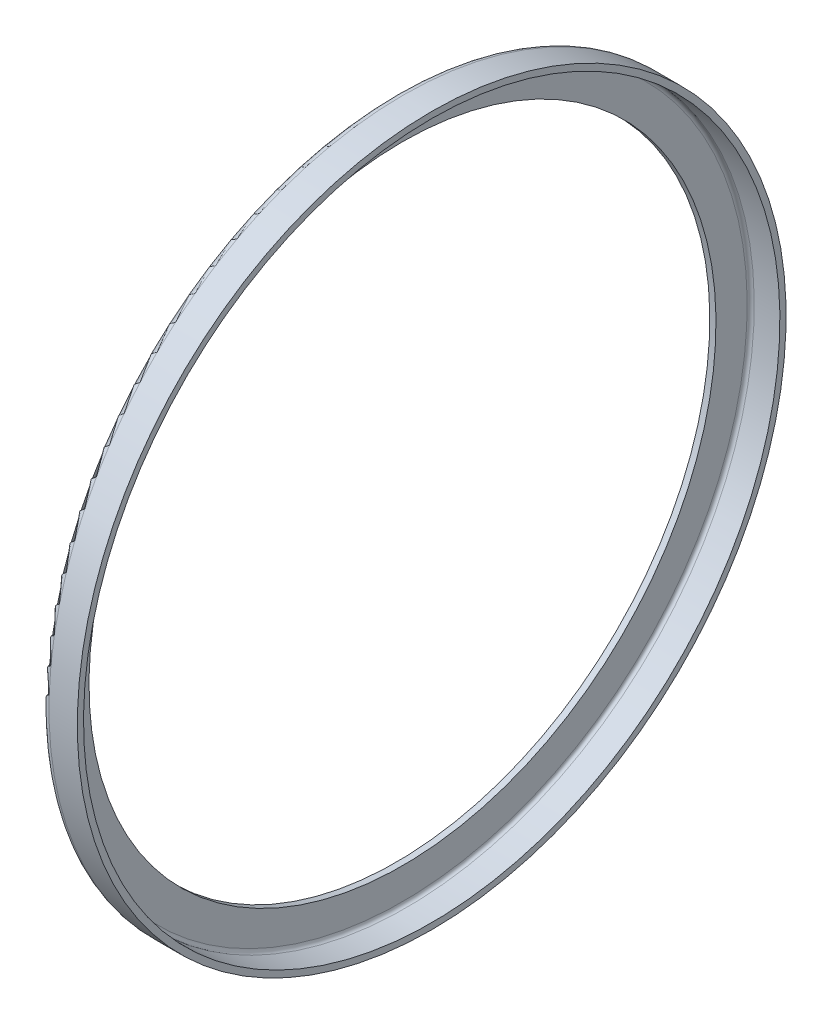
ISO-10303-21;
HEADER;
FILE_DESCRIPTION(('STEP AP214'),'2;1');
FILE_NAME('part.step','',(''),(''),'','','');
FILE_SCHEMA(('AUTOMOTIVE_DESIGN { 1 0 10303 214 1 1 1 1 }'));
ENDSEC;
DATA;
#1=APPLICATION_CONTEXT('core data for automotive mechanical design processes');
#2=APPLICATION_PROTOCOL_DEFINITION('international standard','automotive_design',2000,#1);
#3=PRODUCT_CONTEXT('',#1,'mechanical');
#4=PRODUCT('Part','Part','',(#3));
#5=PRODUCT_RELATED_PRODUCT_CATEGORY('part','',(#4));
#6=PRODUCT_DEFINITION_FORMATION('','',#4);
#7=PRODUCT_DEFINITION_CONTEXT('part definition',#1,'design');
#8=PRODUCT_DEFINITION('design','',#6,#7);
#9=PRODUCT_DEFINITION_SHAPE('','',#8);
#10=(LENGTH_UNIT() NAMED_UNIT(*) SI_UNIT(.MILLI.,.METRE.));
#11=(NAMED_UNIT(*) PLANE_ANGLE_UNIT() SI_UNIT($,.RADIAN.));
#12=(NAMED_UNIT(*) SI_UNIT($,.STERADIAN.) SOLID_ANGLE_UNIT());
#13=UNCERTAINTY_MEASURE_WITH_UNIT(LENGTH_MEASURE(1.E-05),#10,'distance_accuracy_value','');
#14=(GEOMETRIC_REPRESENTATION_CONTEXT(3) GLOBAL_UNCERTAINTY_ASSIGNED_CONTEXT((#13)) GLOBAL_UNIT_ASSIGNED_CONTEXT((#10,
#11,#12)) REPRESENTATION_CONTEXT('',''));
#15=CARTESIAN_POINT('',(0.,0.,0.));
#16=DIRECTION('',(0.,0.,1.));
#17=DIRECTION('',(1.,0.,0.));
#18=AXIS2_PLACEMENT_3D('',#15,#16,#17);
#19=CARTESIAN_POINT('',(0.2625,0.,0.));
#20=DIRECTION('',(1.,0.,0.));
#21=DIRECTION('',(0.,1.,0.));
#22=AXIS2_PLACEMENT_3D('',#19,#20,#21);
#23=CYLINDRICAL_SURFACE('',#22,26.5625);
#24=CARTESIAN_POINT('',(0.,0.,0.));
#25=DIRECTION('',(-1.,0.,0.));
#26=DIRECTION('',(0.,1.,0.));
#27=AXIS2_PLACEMENT_3D('',#24,#25,#26);
#28=CIRCLE('',#27,26.5625);
#29=CARTESIAN_POINT('',(0.,26.5625,0.));
#30=VERTEX_POINT('',#29);
#31=EDGE_CURVE('E11',#30,#30,#28,.T.);
#32=ORIENTED_EDGE('',*,*,#31,.T.);
#33=EDGE_LOOP('',(#32));
#34=FACE_BOUND('',#33,.T.);
#35=CARTESIAN_POINT('',(0.525,0.,0.));
#36=DIRECTION('',(-1.,0.,0.));
#37=DIRECTION('',(0.,1.,0.));
#38=AXIS2_PLACEMENT_3D('',#35,#36,#37);
#39=CIRCLE('',#38,26.5625);
#40=CARTESIAN_POINT('',(0.525,26.5625,0.));
#41=VERTEX_POINT('',#40);
#42=EDGE_CURVE('E62',#41,#41,#39,.T.);
#43=ORIENTED_EDGE('',*,*,#42,.F.);
#44=EDGE_LOOP('',(#43));
#45=FACE_BOUND('',#44,.T.);
#46=ADVANCED_FACE('F17',(#34,#45),#23,.F.);
#47=CARTESIAN_POINT('',(0.,27.995,0.));
#48=DIRECTION('',(-1.,0.,0.));
#49=DIRECTION('',(0.,1.,0.));
#50=AXIS2_PLACEMENT_3D('',#47,#48,#49);
#51=PLANE('',#50);
#52=CARTESIAN_POINT('',(0.,0.,0.));
#53=DIRECTION('',(-1.,0.,0.));
#54=DIRECTION('',(0.,1.,0.));
#55=AXIS2_PLACEMENT_3D('',#52,#53,#54);
#56=CIRCLE('',#55,29.4275);
#57=CARTESIAN_POINT('',(0.,29.4275,0.));
#58=VERTEX_POINT('',#57);
#59=EDGE_CURVE('E26',#58,#58,#56,.T.);
#60=ORIENTED_EDGE('',*,*,#59,.T.);
#61=EDGE_LOOP('',(#60));
#62=FACE_BOUND('',#61,.T.);
#63=ORIENTED_EDGE('',*,*,#31,.F.);
#64=EDGE_LOOP('',(#63));
#65=FACE_BOUND('',#64,.T.);
#66=ADVANCED_FACE('F71',(#62,#65),#51,.T.);
#67=CARTESIAN_POINT('',(0.6,0.,0.));
#68=DIRECTION('',(-1.,0.,0.));
#69=DIRECTION('',(0.,0.,1.));
#70=AXIS2_PLACEMENT_3D('',#67,#68,#69);
#71=TOROIDAL_SURFACE('',#70,29.4275,0.6);
#72=CARTESIAN_POINT('',(0.6,0.,0.));
#73=DIRECTION('',(-1.,0.,0.));
#74=DIRECTION('',(0.,1.,0.));
#75=AXIS2_PLACEMENT_3D('',#72,#73,#74);
#76=CIRCLE('',#75,30.0275);
#77=CARTESIAN_POINT('',(0.6,30.0275,0.));
#78=VERTEX_POINT('',#77);
#79=EDGE_CURVE('E52',#78,#78,#76,.T.);
#80=ORIENTED_EDGE('',*,*,#79,.T.);
#81=EDGE_LOOP('',(#80));
#82=FACE_BOUND('',#81,.T.);
#83=ORIENTED_EDGE('',*,*,#59,.F.);
#84=EDGE_LOOP('',(#83));
#85=FACE_BOUND('',#84,.T.);
#86=ADVANCED_FACE('F19',(#82,#85),#71,.T.);
#87=CARTESIAN_POINT('',(1.8,0.,0.));
#88=DIRECTION('',(1.,0.,0.));
#89=DIRECTION('',(0.,1.,0.));
#90=AXIS2_PLACEMENT_3D('',#87,#88,#89);
#91=CYLINDRICAL_SURFACE('',#90,30.0275);
#92=CARTESIAN_POINT('',(3.,0.,0.));
#93=DIRECTION('',(-1.,0.,0.));
#94=DIRECTION('',(0.,1.,0.));
#95=AXIS2_PLACEMENT_3D('',#92,#93,#94);
#96=CIRCLE('',#95,30.0275);
#97=CARTESIAN_POINT('',(3.,30.0275,0.));
#98=VERTEX_POINT('',#97);
#99=EDGE_CURVE('E48',#98,#98,#96,.T.);
#100=ORIENTED_EDGE('',*,*,#99,.T.);
#101=EDGE_LOOP('',(#100));
#102=FACE_BOUND('',#101,.T.);
#103=ORIENTED_EDGE('',*,*,#79,.F.);
#104=EDGE_LOOP('',(#103));
#105=FACE_BOUND('',#104,.T.);
#106=ADVANCED_FACE('F49',(#102,#105),#91,.T.);
#107=CARTESIAN_POINT('',(3.,29.765,0.));
#108=DIRECTION('',(1.,0.,0.));
#109=DIRECTION('',(0.,-1.,0.));
#110=AXIS2_PLACEMENT_3D('',#107,#108,#109);
#111=PLANE('',#110);
#112=CARTESIAN_POINT('',(3.,0.,0.));
#113=DIRECTION('',(-1.,0.,0.));
#114=DIRECTION('',(0.,1.,0.));
#115=AXIS2_PLACEMENT_3D('',#112,#113,#114);
#116=CIRCLE('',#115,29.5025);
#117=CARTESIAN_POINT('',(3.,29.5025,0.));
#118=VERTEX_POINT('',#117);
#119=EDGE_CURVE('E53',#118,#118,#116,.T.);
#120=ORIENTED_EDGE('',*,*,#119,.T.);
#121=EDGE_LOOP('',(#120));
#122=FACE_BOUND('',#121,.T.);
#123=ORIENTED_EDGE('',*,*,#99,.F.);
#124=EDGE_LOOP('',(#123));
#125=FACE_BOUND('',#124,.T.);
#126=ADVANCED_FACE('F83',(#122,#125),#111,.T.);
#127=CARTESIAN_POINT('',(1.9125,0.,0.));
#128=DIRECTION('',(1.,0.,0.));
#129=DIRECTION('',(0.,1.,0.));
#130=AXIS2_PLACEMENT_3D('',#127,#128,#129);
#131=CYLINDRICAL_SURFACE('',#130,29.5025);
#132=CARTESIAN_POINT('',(0.825,0.,0.));
#133=DIRECTION('',(-1.,0.,0.));
#134=DIRECTION('',(0.,1.,0.));
#135=AXIS2_PLACEMENT_3D('',#132,#133,#134);
#136=CIRCLE('',#135,29.5025);
#137=CARTESIAN_POINT('',(0.825,29.5025,0.));
#138=VERTEX_POINT('',#137);
#139=EDGE_CURVE('E55',#138,#138,#136,.T.);
#140=ORIENTED_EDGE('',*,*,#139,.T.);
#141=EDGE_LOOP('',(#140));
#142=FACE_BOUND('',#141,.T.);
#143=ORIENTED_EDGE('',*,*,#119,.F.);
#144=EDGE_LOOP('',(#143));
#145=FACE_BOUND('',#144,.T.);
#146=ADVANCED_FACE('F79',(#142,#145),#131,.F.);
#147=CARTESIAN_POINT('',(0.825,0.,0.));
#148=DIRECTION('',(-1.,0.,0.));
#149=DIRECTION('',(0.,0.,1.));
#150=AXIS2_PLACEMENT_3D('',#147,#148,#149);
#151=TOROIDAL_SURFACE('',#150,29.2025,0.3);
#152=CARTESIAN_POINT('',(0.525,0.,0.));
#153=DIRECTION('',(-1.,0.,0.));
#154=DIRECTION('',(0.,1.,0.));
#155=AXIS2_PLACEMENT_3D('',#152,#153,#154);
#156=CIRCLE('',#155,29.2025);
#157=CARTESIAN_POINT('',(0.525,29.2025,0.));
#158=VERTEX_POINT('',#157);
#159=EDGE_CURVE('E59',#158,#158,#156,.T.);
#160=ORIENTED_EDGE('',*,*,#159,.T.);
#161=EDGE_LOOP('',(#160));
#162=FACE_BOUND('',#161,.T.);
#163=ORIENTED_EDGE('',*,*,#139,.F.);
#164=EDGE_LOOP('',(#163));
#165=FACE_BOUND('',#164,.T.);
#166=ADVANCED_FACE('F82',(#162,#165),#151,.F.);
#167=CARTESIAN_POINT('',(0.525,27.8825,0.));
#168=DIRECTION('',(1.,0.,0.));
#169=DIRECTION('',(0.,-1.,0.));
#170=AXIS2_PLACEMENT_3D('',#167,#168,#169);
#171=PLANE('',#170);
#172=ORIENTED_EDGE('',*,*,#42,.T.);
#173=EDGE_LOOP('',(#172));
#174=FACE_BOUND('',#173,.T.);
#175=ORIENTED_EDGE('',*,*,#159,.F.);
#176=EDGE_LOOP('',(#175));
#177=FACE_BOUND('',#176,.T.);
#178=ADVANCED_FACE('F67',(#174,#177),#171,.T.);
#179=CLOSED_SHELL('',(#46,#66,#86,#106,#126,#146,#166,#178));
#180=MANIFOLD_SOLID_BREP('B1',#179);
#181=ADVANCED_BREP_SHAPE_REPRESENTATION('',(#18,#180),#14);
#182=SHAPE_DEFINITION_REPRESENTATION(#9,#181);
ENDSEC;
END-ISO-10303-21;
